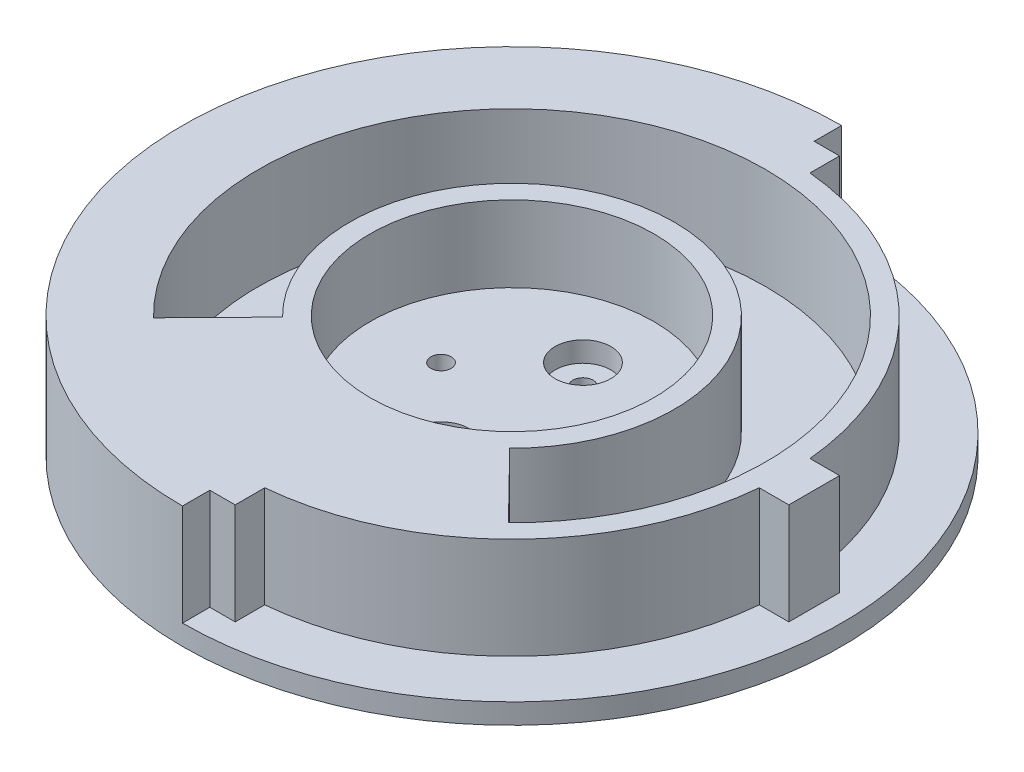
ISO-10303-21;
HEADER;
FILE_DESCRIPTION(('STEP AP214'),'2;1');
FILE_NAME('part.step','',(''),(''),'','','');
FILE_SCHEMA(('AUTOMOTIVE_DESIGN { 1 0 10303 214 1 1 1 1 }'));
ENDSEC;
DATA;
#1=APPLICATION_CONTEXT('core data for automotive mechanical design processes');
#2=APPLICATION_PROTOCOL_DEFINITION('international standard','automotive_design',2000,#1);
#3=PRODUCT_CONTEXT('',#1,'mechanical');
#4=PRODUCT('Part','Part','',(#3));
#5=PRODUCT_RELATED_PRODUCT_CATEGORY('part','',(#4));
#6=PRODUCT_DEFINITION_FORMATION('','',#4);
#7=PRODUCT_DEFINITION_CONTEXT('part definition',#1,'design');
#8=PRODUCT_DEFINITION('design','',#6,#7);
#9=PRODUCT_DEFINITION_SHAPE('','',#8);
#10=(LENGTH_UNIT() NAMED_UNIT(*) SI_UNIT(.MILLI.,.METRE.));
#11=(NAMED_UNIT(*) PLANE_ANGLE_UNIT() SI_UNIT($,.RADIAN.));
#12=(NAMED_UNIT(*) SI_UNIT($,.STERADIAN.) SOLID_ANGLE_UNIT());
#13=UNCERTAINTY_MEASURE_WITH_UNIT(LENGTH_MEASURE(1.E-05),#10,'distance_accuracy_value','');
#14=(GEOMETRIC_REPRESENTATION_CONTEXT(3) GLOBAL_UNCERTAINTY_ASSIGNED_CONTEXT((#13)) GLOBAL_UNIT_ASSIGNED_CONTEXT((#10,
#11,#12)) REPRESENTATION_CONTEXT('',''));
#15=CARTESIAN_POINT('',(0.,0.,0.));
#16=DIRECTION('',(0.,0.,1.));
#17=DIRECTION('',(1.,0.,0.));
#18=AXIS2_PLACEMENT_3D('',#15,#16,#17);
#19=CARTESIAN_POINT('',(0.,10.,7.));
#20=DIRECTION('',(0.,-1.,0.));
#21=DIRECTION('',(0.,0.,-1.));
#22=AXIS2_PLACEMENT_3D('',#19,#20,#21);
#23=CYLINDRICAL_SURFACE('',#22,1.);
#24=CARTESIAN_POINT('',(0.,-2.,7.));
#25=DIRECTION('',(0.,-1.,0.));
#26=DIRECTION('',(0.,0.,-1.));
#27=AXIS2_PLACEMENT_3D('',#24,#25,#26);
#28=CIRCLE('',#27,1.);
#29=CARTESIAN_POINT('',(0.,-2.,6.));
#30=VERTEX_POINT('',#29);
#31=EDGE_CURVE('E245',#30,#30,#28,.T.);
#32=ORIENTED_EDGE('',*,*,#31,.T.);
#33=EDGE_LOOP('',(#32));
#34=FACE_BOUND('',#33,.T.);
#35=CARTESIAN_POINT('',(0.,0.5,7.));
#36=DIRECTION('',(0.,1.,0.));
#37=DIRECTION('',(0.,0.,1.));
#38=AXIS2_PLACEMENT_3D('',#35,#36,#37);
#39=CIRCLE('',#38,1.);
#40=CARTESIAN_POINT('',(0.,0.5,8.));
#41=VERTEX_POINT('',#40);
#42=EDGE_CURVE('E39',#41,#41,#39,.F.);
#43=ORIENTED_EDGE('',*,*,#42,.F.);
#44=EDGE_LOOP('',(#43));
#45=FACE_BOUND('',#44,.T.);
#46=ADVANCED_FACE('F35',(#34,#45),#23,.F.);
#47=CARTESIAN_POINT('',(0.,10.,-7.));
#48=DIRECTION('',(0.,-1.,0.));
#49=DIRECTION('',(0.,0.,-1.));
#50=AXIS2_PLACEMENT_3D('',#47,#48,#49);
#51=CYLINDRICAL_SURFACE('',#50,1.);
#52=CARTESIAN_POINT('',(0.,-2.,-7.));
#53=DIRECTION('',(0.,-1.,0.));
#54=DIRECTION('',(0.,0.,-1.));
#55=AXIS2_PLACEMENT_3D('',#52,#53,#54);
#56=CIRCLE('',#55,1.);
#57=CARTESIAN_POINT('',(0.,-2.,-8.));
#58=VERTEX_POINT('',#57);
#59=EDGE_CURVE('E175',#58,#58,#56,.T.);
#60=ORIENTED_EDGE('',*,*,#59,.T.);
#61=EDGE_LOOP('',(#60));
#62=FACE_BOUND('',#61,.T.);
#63=CARTESIAN_POINT('',(0.,0.5,-7.));
#64=DIRECTION('',(0.,1.,0.));
#65=DIRECTION('',(0.,0.,1.));
#66=AXIS2_PLACEMENT_3D('',#63,#64,#65);
#67=CIRCLE('',#66,1.);
#68=CARTESIAN_POINT('',(0.,0.5,-6.));
#69=VERTEX_POINT('',#68);
#70=EDGE_CURVE('E246',#69,#69,#67,.F.);
#71=ORIENTED_EDGE('',*,*,#70,.F.);
#72=EDGE_LOOP('',(#71));
#73=FACE_BOUND('',#72,.T.);
#74=ADVANCED_FACE('F367',(#62,#73),#51,.F.);
#75=CARTESIAN_POINT('',(0.,0.,0.));
#76=DIRECTION('',(0.,-1.,0.));
#77=DIRECTION('',(0.,0.,-1.));
#78=AXIS2_PLACEMENT_3D('',#75,#76,#77);
#79=PLANE('',#78);
#80=DIRECTION('',(0.,0.,-1.));
#81=VECTOR('',#80,1.);
#82=CARTESIAN_POINT('',(0.,0.,-29.8));
#83=LINE('',#82,#81);
#84=CARTESIAN_POINT('',(0.,0.,-29.8));
#85=VERTEX_POINT('',#84);
#86=CARTESIAN_POINT('',(0.,0.,-32.5));
#87=VERTEX_POINT('',#86);
#88=EDGE_CURVE('E174',#85,#87,#83,.T.);
#89=ORIENTED_EDGE('',*,*,#88,.F.);
#90=DIRECTION('',(-1.,0.,0.));
#91=VECTOR('',#90,1.);
#92=CARTESIAN_POINT('',(-2.5,0.,-29.8));
#93=LINE('',#92,#91);
#94=CARTESIAN_POINT('',(2.5,0.,-29.8));
#95=VERTEX_POINT('',#94);
#96=EDGE_CURVE('E173',#95,#85,#93,.T.);
#97=ORIENTED_EDGE('',*,*,#96,.F.);
#98=DIRECTION('',(0.,0.,-1.));
#99=VECTOR('',#98,1.);
#100=CARTESIAN_POINT('',(2.5,0.,0.));
#101=LINE('',#100,#99);
#102=CARTESIAN_POINT('',(2.5,0.,-26.8840101175401));
#103=VERTEX_POINT('',#102);
#104=EDGE_CURVE('E44',#103,#95,#101,.T.);
#105=ORIENTED_EDGE('',*,*,#104,.F.);
#106=CARTESIAN_POINT('',(0.,0.,0.));
#107=DIRECTION('',(0.,1.,0.));
#108=DIRECTION('',(0.,0.,1.));
#109=AXIS2_PLACEMENT_3D('',#106,#107,#108);
#110=CIRCLE('',#109,27.);
#111=CARTESIAN_POINT('',(26.8840101175398,0.,-2.50000000000318));
#112=VERTEX_POINT('',#111);
#113=EDGE_CURVE('E196',#112,#103,#110,.T.);
#114=ORIENTED_EDGE('',*,*,#113,.F.);
#115=DIRECTION('',(-1.,0.,0.));
#116=VECTOR('',#115,1.);
#117=CARTESIAN_POINT('',(29.8000000000026,0.,-2.50000000000318));
#118=LINE('',#117,#116);
#119=CARTESIAN_POINT('',(29.8000000000026,0.,-2.50000000000318));
#120=VERTEX_POINT('',#119);
#121=EDGE_CURVE('E307',#120,#112,#118,.T.);
#122=ORIENTED_EDGE('',*,*,#121,.F.);
#123=DIRECTION('',(0.,0.,-1.));
#124=VECTOR('',#123,1.);
#125=CARTESIAN_POINT('',(29.8000000000026,0.,-2.50000000000318));
#126=LINE('',#125,#124);
#127=CARTESIAN_POINT('',(29.8000000000026,0.,2.49999999999682));
#128=VERTEX_POINT('',#127);
#129=EDGE_CURVE('E315',#128,#120,#126,.T.);
#130=ORIENTED_EDGE('',*,*,#129,.F.);
#131=DIRECTION('',(1.,0.,0.));
#132=VECTOR('',#131,1.);
#133=CARTESIAN_POINT('',(29.8000000000026,0.,2.49999999999682));
#134=LINE('',#133,#132);
#135=CARTESIAN_POINT('',(26.8840101175404,0.,2.49999999999682));
#136=VERTEX_POINT('',#135);
#137=EDGE_CURVE('E303',#136,#128,#134,.T.);
#138=ORIENTED_EDGE('',*,*,#137,.F.);
#139=CARTESIAN_POINT('',(2.50000000000583,0.,26.8840101175396));
#140=VERTEX_POINT('',#139);
#141=EDGE_CURVE('E214',#140,#136,#110,.T.);
#142=ORIENTED_EDGE('',*,*,#141,.F.);
#143=DIRECTION('',(0.,0.,-1.));
#144=VECTOR('',#143,1.);
#145=CARTESIAN_POINT('',(2.50000000000583,0.,29.7999999999995));
#146=LINE('',#145,#144);
#147=CARTESIAN_POINT('',(2.50000000000583,0.,29.7999999999995));
#148=VERTEX_POINT('',#147);
#149=EDGE_CURVE('E292',#148,#140,#146,.T.);
#150=ORIENTED_EDGE('',*,*,#149,.F.);
#151=DIRECTION('',(1.,0.,0.));
#152=VECTOR('',#151,1.);
#153=CARTESIAN_POINT('',(2.50000000000583,0.,29.7999999999995));
#154=LINE('',#153,#152);
#155=CARTESIAN_POINT('',(0.,0.,29.7999999999995));
#156=VERTEX_POINT('',#155);
#157=EDGE_CURVE('E52',#156,#148,#154,.T.);
#158=ORIENTED_EDGE('',*,*,#157,.F.);
#159=DIRECTION('',(0.,0.,-1.));
#160=VECTOR('',#159,1.);
#161=CARTESIAN_POINT('',(0.,0.,29.7999999999995));
#162=LINE('',#161,#160);
#163=CARTESIAN_POINT('',(0.,0.,32.5));
#164=VERTEX_POINT('',#163);
#165=EDGE_CURVE('E278',#164,#156,#162,.T.);
#166=ORIENTED_EDGE('',*,*,#165,.F.);
#167=CARTESIAN_POINT('',(0.,0.,0.));
#168=DIRECTION('',(0.,-1.,0.));
#169=DIRECTION('',(0.,0.,-1.));
#170=AXIS2_PLACEMENT_3D('',#167,#168,#169);
#171=CIRCLE('',#170,32.5);
#172=EDGE_CURVE('E192',#87,#164,#171,.T.);
#173=ORIENTED_EDGE('',*,*,#172,.F.);
#174=EDGE_LOOP('',(#89,#97,#105,#114,#122,#130,#138,#142,#150,#158,#166,#173));
#175=FACE_BOUND('',#174,.T.);
#176=ADVANCED_FACE('F334',(#175),#79,.F.);
#177=CARTESIAN_POINT('',(-2.5,10.,-29.8));
#178=DIRECTION('',(0.,0.,1.));
#179=DIRECTION('',(1.,0.,0.));
#180=AXIS2_PLACEMENT_3D('',#177,#178,#179);
#181=PLANE('',#180);
#182=DIRECTION('',(0.,-1.,0.));
#183=VECTOR('',#182,1.);
#184=CARTESIAN_POINT('',(0.,82.6722092687432,-29.8));
#185=LINE('',#184,#183);
#186=CARTESIAN_POINT('',(0.,9.99999999999999,-29.8));
#187=VERTEX_POINT('',#186);
#188=EDGE_CURVE('E157',#187,#85,#185,.T.);
#189=ORIENTED_EDGE('',*,*,#188,.F.);
#190=DIRECTION('',(-1.,0.,0.));
#191=VECTOR('',#190,1.);
#192=CARTESIAN_POINT('',(-2.5,10.,-29.8));
#193=LINE('',#192,#191);
#194=CARTESIAN_POINT('',(2.5,10.,-29.8));
#195=VERTEX_POINT('',#194);
#196=EDGE_CURVE('E171',#195,#187,#193,.T.);
#197=ORIENTED_EDGE('',*,*,#196,.F.);
#198=DIRECTION('',(0.,-1.,0.));
#199=VECTOR('',#198,1.);
#200=CARTESIAN_POINT('',(2.5,10.,-29.8));
#201=LINE('',#200,#199);
#202=EDGE_CURVE('E181',#195,#95,#201,.T.);
#203=ORIENTED_EDGE('',*,*,#202,.T.);
#204=ORIENTED_EDGE('',*,*,#96,.T.);
#205=EDGE_LOOP('',(#189,#197,#203,#204));
#206=FACE_BOUND('',#205,.T.);
#207=ADVANCED_FACE('F169',(#206),#181,.F.);
#208=CARTESIAN_POINT('',(2.50000000000583,10.,29.7999999999995));
#209=DIRECTION('',(0.,0.,-1.));
#210=DIRECTION('',(-1.,0.,0.));
#211=AXIS2_PLACEMENT_3D('',#208,#209,#210);
#212=PLANE('',#211);
#213=DIRECTION('',(0.,-1.,0.));
#214=VECTOR('',#213,1.);
#215=CARTESIAN_POINT('',(0.,82.6722092687432,29.7999999999995));
#216=LINE('',#215,#214);
#217=CARTESIAN_POINT('',(0.,9.99999999999999,29.7999999999995));
#218=VERTEX_POINT('',#217);
#219=EDGE_CURVE('E164',#218,#156,#216,.T.);
#220=ORIENTED_EDGE('',*,*,#219,.T.);
#221=ORIENTED_EDGE('',*,*,#157,.T.);
#222=DIRECTION('',(0.,-1.,0.));
#223=VECTOR('',#222,1.);
#224=CARTESIAN_POINT('',(2.50000000000583,10.,29.7999999999995));
#225=LINE('',#224,#223);
#226=CARTESIAN_POINT('',(2.50000000000583,10.,29.7999999999995));
#227=VERTEX_POINT('',#226);
#228=EDGE_CURVE('E295',#227,#148,#225,.T.);
#229=ORIENTED_EDGE('',*,*,#228,.F.);
#230=DIRECTION('',(1.,0.,0.));
#231=VECTOR('',#230,1.);
#232=CARTESIAN_POINT('',(2.50000000000583,10.,29.7999999999995));
#233=LINE('',#232,#231);
#234=EDGE_CURVE('E289',#218,#227,#233,.T.);
#235=ORIENTED_EDGE('',*,*,#234,.F.);
#236=EDGE_LOOP('',(#220,#221,#229,#235));
#237=FACE_BOUND('',#236,.T.);
#238=ADVANCED_FACE('F365',(#237),#212,.F.);
#239=CARTESIAN_POINT('',(0.,10.,0.));
#240=DIRECTION('',(0.,-1.,0.));
#241=DIRECTION('',(0.,0.,-1.));
#242=AXIS2_PLACEMENT_3D('',#239,#240,#241);
#243=CYLINDRICAL_SURFACE('',#242,27.);
#244=DIRECTION('',(0.,-1.,0.));
#245=VECTOR('',#244,1.);
#246=CARTESIAN_POINT('',(2.50000000000583,10.,26.8840101175396));
#247=LINE('',#246,#245);
#248=CARTESIAN_POINT('',(2.50000000000583,10.,26.8840101175396));
#249=VERTEX_POINT('',#248);
#250=EDGE_CURVE('E301',#140,#249,#247,.F.);
#251=ORIENTED_EDGE('',*,*,#250,.F.);
#252=ORIENTED_EDGE('',*,*,#141,.T.);
#253=DIRECTION('',(0.,-1.,0.));
#254=VECTOR('',#253,1.);
#255=CARTESIAN_POINT('',(26.8840101175404,10.,2.49999999999682));
#256=LINE('',#255,#254);
#257=CARTESIAN_POINT('',(26.8840101175404,10.,2.49999999999682));
#258=VERTEX_POINT('',#257);
#259=EDGE_CURVE('E188',#258,#136,#256,.T.);
#260=ORIENTED_EDGE('',*,*,#259,.F.);
#261=CARTESIAN_POINT('',(0.,10.,0.));
#262=DIRECTION('',(0.,1.,0.));
#263=DIRECTION('',(0.,0.,1.));
#264=AXIS2_PLACEMENT_3D('',#261,#262,#263);
#265=CIRCLE('',#264,27.);
#266=EDGE_CURVE('E60',#249,#258,#265,.T.);
#267=ORIENTED_EDGE('',*,*,#266,.F.);
#268=EDGE_LOOP('',(#251,#252,#260,#267));
#269=FACE_BOUND('',#268,.T.);
#270=ADVANCED_FACE('F37',(#269),#243,.T.);
#271=DIRECTION('',(0.,-1.,0.));
#272=VECTOR('',#271,1.);
#273=CARTESIAN_POINT('',(26.8840101175398,10.,-2.50000000000318));
#274=LINE('',#273,#272);
#275=CARTESIAN_POINT('',(26.8840101175398,10.,-2.50000000000318));
#276=VERTEX_POINT('',#275);
#277=EDGE_CURVE('E325',#112,#276,#274,.F.);
#278=ORIENTED_EDGE('',*,*,#277,.F.);
#279=ORIENTED_EDGE('',*,*,#113,.T.);
#280=DIRECTION('',(0.,-1.,0.));
#281=VECTOR('',#280,1.);
#282=CARTESIAN_POINT('',(2.5,10.,-26.8840101175401));
#283=LINE('',#282,#281);
#284=CARTESIAN_POINT('',(2.5,10.,-26.8840101175401));
#285=VERTEX_POINT('',#284);
#286=EDGE_CURVE('E183',#285,#103,#283,.T.);
#287=ORIENTED_EDGE('',*,*,#286,.F.);
#288=EDGE_CURVE('E233',#276,#285,#265,.T.);
#289=ORIENTED_EDGE('',*,*,#288,.F.);
#290=EDGE_LOOP('',(#278,#279,#287,#289));
#291=FACE_BOUND('',#290,.T.);
#292=ADVANCED_FACE('F358',(#291),#243,.T.);
#293=CARTESIAN_POINT('',(0.,10.,0.));
#294=DIRECTION('',(0.,1.,0.));
#295=DIRECTION('',(0.,0.,1.));
#296=AXIS2_PLACEMENT_3D('',#293,#294,#295);
#297=PLANE('',#296);
#298=ORIENTED_EDGE('',*,*,#196,.T.);
#299=DIRECTION('',(0.,0.,-1.));
#300=VECTOR('',#299,1.);
#301=CARTESIAN_POINT('',(0.,9.99999999999999,-29.8));
#302=LINE('',#301,#300);
#303=CARTESIAN_POINT('',(0.,9.99999999999999,-32.5));
#304=VERTEX_POINT('',#303);
#305=EDGE_CURVE('E153',#187,#304,#302,.T.);
#306=ORIENTED_EDGE('',*,*,#305,.T.);
#307=CARTESIAN_POINT('',(0.,9.99999999999999,0.));
#308=DIRECTION('',(0.,1.,0.));
#309=DIRECTION('',(0.,0.,1.));
#310=AXIS2_PLACEMENT_3D('',#307,#308,#309);
#311=CIRCLE('',#310,32.5);
#312=CARTESIAN_POINT('',(0.,9.99999999999999,32.5));
#313=VERTEX_POINT('',#312);
#314=EDGE_CURVE('E163',#304,#313,#311,.T.);
#315=ORIENTED_EDGE('',*,*,#314,.T.);
#316=DIRECTION('',(0.,0.,-1.));
#317=VECTOR('',#316,1.);
#318=CARTESIAN_POINT('',(0.,9.99999999999999,29.7999999999995));
#319=LINE('',#318,#317);
#320=EDGE_CURVE('E282',#313,#218,#319,.T.);
#321=ORIENTED_EDGE('',*,*,#320,.T.);
#322=ORIENTED_EDGE('',*,*,#234,.T.);
#323=DIRECTION('',(0.,0.,-1.));
#324=VECTOR('',#323,1.);
#325=CARTESIAN_POINT('',(2.50000000000583,10.,29.7999999999995));
#326=LINE('',#325,#324);
#327=EDGE_CURVE('E291',#227,#249,#326,.T.);
#328=ORIENTED_EDGE('',*,*,#327,.T.);
#329=ORIENTED_EDGE('',*,*,#266,.T.);
#330=DIRECTION('',(1.,0.,0.));
#331=VECTOR('',#330,1.);
#332=CARTESIAN_POINT('',(29.8000000000026,10.,2.49999999999682));
#333=LINE('',#332,#331);
#334=CARTESIAN_POINT('',(29.8000000000026,10.,2.49999999999682));
#335=VERTEX_POINT('',#334);
#336=EDGE_CURVE('E304',#258,#335,#333,.T.);
#337=ORIENTED_EDGE('',*,*,#336,.T.);
#338=DIRECTION('',(0.,0.,-1.));
#339=VECTOR('',#338,1.);
#340=CARTESIAN_POINT('',(29.8000000000026,10.,-2.50000000000318));
#341=LINE('',#340,#339);
#342=CARTESIAN_POINT('',(29.8000000000026,10.,-2.50000000000318));
#343=VERTEX_POINT('',#342);
#344=EDGE_CURVE('E306',#335,#343,#341,.T.);
#345=ORIENTED_EDGE('',*,*,#344,.T.);
#346=DIRECTION('',(-1.,0.,0.));
#347=VECTOR('',#346,1.);
#348=CARTESIAN_POINT('',(29.8000000000026,10.,-2.50000000000318));
#349=LINE('',#348,#347);
#350=EDGE_CURVE('E309',#343,#276,#349,.T.);
#351=ORIENTED_EDGE('',*,*,#350,.T.);
#352=ORIENTED_EDGE('',*,*,#288,.T.);
#353=DIRECTION('',(0.,0.,-1.));
#354=VECTOR('',#353,1.);
#355=CARTESIAN_POINT('',(2.5,10.,-29.8));
#356=LINE('',#355,#354);
#357=EDGE_CURVE('E180',#285,#195,#356,.T.);
#358=ORIENTED_EDGE('',*,*,#357,.T.);
#359=EDGE_LOOP('',(#298,#306,#315,#321,#322,#328,#329,#337,#345,#351,#352,#358));
#360=FACE_BOUND('',#359,.T.);
#361=CARTESIAN_POINT('',(0.,10.,0.));
#362=DIRECTION('',(0.,1.,0.));
#363=DIRECTION('',(0.,0.,1.));
#364=AXIS2_PLACEMENT_3D('',#361,#362,#363);
#365=CIRCLE('',#364,14.);
#366=CARTESIAN_POINT('',(0.,10.,14.));
#367=VERTEX_POINT('',#366);
#368=EDGE_CURVE('E230',#367,#367,#365,.T.);
#369=ORIENTED_EDGE('',*,*,#368,.F.);
#370=EDGE_LOOP('',(#369));
#371=FACE_BOUND('',#370,.T.);
#372=DIRECTION('',(0.7,0.,-0.714142842854285));
#373=VECTOR('',#372,1.);
#374=CARTESIAN_POINT('',(-17.5,10.,17.8535710713571));
#375=LINE('',#374,#373);
#376=CARTESIAN_POINT('',(-17.5,10.,17.8535710713571));
#377=VERTEX_POINT('',#376);
#378=CARTESIAN_POINT('',(-11.2,10.,11.4262854856686));
#379=VERTEX_POINT('',#378);
#380=EDGE_CURVE('E201',#377,#379,#375,.T.);
#381=ORIENTED_EDGE('',*,*,#380,.F.);
#382=CARTESIAN_POINT('',(0.,10.,0.));
#383=DIRECTION('',(0.,1.,0.));
#384=DIRECTION('',(0.,0.,1.));
#385=AXIS2_PLACEMENT_3D('',#382,#383,#384);
#386=CIRCLE('',#385,25.);
#387=CARTESIAN_POINT('',(17.5,10.,17.8535710713571));
#388=VERTEX_POINT('',#387);
#389=EDGE_CURVE('E199',#388,#377,#386,.T.);
#390=ORIENTED_EDGE('',*,*,#389,.F.);
#391=DIRECTION('',(0.7,0.,0.714142842854285));
#392=VECTOR('',#391,1.);
#393=CARTESIAN_POINT('',(17.5,10.,17.8535710713571));
#394=LINE('',#393,#392);
#395=CARTESIAN_POINT('',(11.2,10.,11.4262854856686));
#396=VERTEX_POINT('',#395);
#397=EDGE_CURVE('E207',#396,#388,#394,.T.);
#398=ORIENTED_EDGE('',*,*,#397,.F.);
#399=CARTESIAN_POINT('',(0.,10.,0.));
#400=DIRECTION('',(0.,-1.,0.));
#401=DIRECTION('',(0.,0.,1.));
#402=AXIS2_PLACEMENT_3D('',#399,#400,#401);
#403=CIRCLE('',#402,16.);
#404=EDGE_CURVE('E204',#379,#396,#403,.T.);
#405=ORIENTED_EDGE('',*,*,#404,.F.);
#406=EDGE_LOOP('',(#381,#390,#398,#405));
#407=FACE_BOUND('',#406,.T.);
#408=ADVANCED_FACE('F177',(#360,#371,#407),#297,.T.);
#409=CARTESIAN_POINT('',(0.,10.,0.));
#410=DIRECTION('',(0.,-1.,0.));
#411=DIRECTION('',(0.,0.,-1.));
#412=AXIS2_PLACEMENT_3D('',#409,#410,#411);
#413=CYLINDRICAL_SURFACE('',#412,14.);
#414=CARTESIAN_POINT('',(0.,2.5,0.));
#415=DIRECTION('',(0.,1.,0.));
#416=DIRECTION('',(0.,0.,1.));
#417=AXIS2_PLACEMENT_3D('',#414,#415,#416);
#418=CIRCLE('',#417,14.);
#419=CARTESIAN_POINT('',(0.,2.5,14.));
#420=VERTEX_POINT('',#419);
#421=EDGE_CURVE('E11',#420,#420,#418,.T.);
#422=ORIENTED_EDGE('',*,*,#421,.F.);
#423=EDGE_LOOP('',(#422));
#424=FACE_BOUND('',#423,.T.);
#425=ORIENTED_EDGE('',*,*,#368,.T.);
#426=EDGE_LOOP('',(#425));
#427=FACE_BOUND('',#426,.T.);
#428=ADVANCED_FACE('F364',(#424,#427),#413,.F.);
#429=CARTESIAN_POINT('',(0.,10.,0.));
#430=DIRECTION('',(0.,-1.,0.));
#431=DIRECTION('',(0.,0.,-1.));
#432=AXIS2_PLACEMENT_3D('',#429,#430,#431);
#433=CYLINDRICAL_SURFACE('',#432,25.);
#434=CARTESIAN_POINT('',(0.,0.,0.));
#435=DIRECTION('',(0.,1.,0.));
#436=DIRECTION('',(0.,0.,1.));
#437=AXIS2_PLACEMENT_3D('',#434,#435,#436);
#438=CIRCLE('',#437,25.);
#439=CARTESIAN_POINT('',(17.5,0.,17.8535710713571));
#440=VERTEX_POINT('',#439);
#441=CARTESIAN_POINT('',(-17.5,0.,17.8535710713571));
#442=VERTEX_POINT('',#441);
#443=EDGE_CURVE('E210',#440,#442,#438,.T.);
#444=ORIENTED_EDGE('',*,*,#443,.F.);
#445=DIRECTION('',(0.,-1.,0.));
#446=VECTOR('',#445,1.);
#447=CARTESIAN_POINT('',(17.5,10.,17.8535710713571));
#448=LINE('',#447,#446);
#449=EDGE_CURVE('E209',#388,#440,#448,.T.);
#450=ORIENTED_EDGE('',*,*,#449,.F.);
#451=ORIENTED_EDGE('',*,*,#389,.T.);
#452=DIRECTION('',(0.,-1.,0.));
#453=VECTOR('',#452,1.);
#454=CARTESIAN_POINT('',(-17.5,10.,17.8535710713571));
#455=LINE('',#454,#453);
#456=EDGE_CURVE('E227',#377,#442,#455,.T.);
#457=ORIENTED_EDGE('',*,*,#456,.T.);
#458=EDGE_LOOP('',(#444,#450,#451,#457));
#459=FACE_BOUND('',#458,.T.);
#460=ADVANCED_FACE('F427',(#459),#433,.F.);
#461=CARTESIAN_POINT('',(-17.5,10.,17.8535710713571));
#462=DIRECTION('',(-0.714142842854285,0.,-0.7));
#463=DIRECTION('',(-0.7,0.,0.714142842854285));
#464=AXIS2_PLACEMENT_3D('',#461,#462,#463);
#465=PLANE('',#464);
#466=DIRECTION('',(0.7,0.,-0.714142842854285));
#467=VECTOR('',#466,1.);
#468=CARTESIAN_POINT('',(-17.5,0.,17.8535710713571));
#469=LINE('',#468,#467);
#470=CARTESIAN_POINT('',(-11.2,0.,11.4262854856686));
#471=VERTEX_POINT('',#470);
#472=EDGE_CURVE('E213',#442,#471,#469,.T.);
#473=ORIENTED_EDGE('',*,*,#472,.F.);
#474=ORIENTED_EDGE('',*,*,#456,.F.);
#475=ORIENTED_EDGE('',*,*,#380,.T.);
#476=DIRECTION('',(0.,-1.,0.));
#477=VECTOR('',#476,1.);
#478=CARTESIAN_POINT('',(-11.2,10.,11.4262854856686));
#479=LINE('',#478,#477);
#480=EDGE_CURVE('E225',#379,#471,#479,.T.);
#481=ORIENTED_EDGE('',*,*,#480,.T.);
#482=EDGE_LOOP('',(#473,#474,#475,#481));
#483=FACE_BOUND('',#482,.T.);
#484=ADVANCED_FACE('F423',(#483),#465,.T.);
#485=CARTESIAN_POINT('',(0.,10.,0.));
#486=DIRECTION('',(0.,-1.,0.));
#487=DIRECTION('',(0.,0.,-1.));
#488=AXIS2_PLACEMENT_3D('',#485,#486,#487);
#489=CYLINDRICAL_SURFACE('',#488,16.);
#490=CARTESIAN_POINT('',(0.,0.,0.));
#491=DIRECTION('',(0.,-1.,0.));
#492=DIRECTION('',(0.,0.,1.));
#493=AXIS2_PLACEMENT_3D('',#490,#491,#492);
#494=CIRCLE('',#493,16.);
#495=CARTESIAN_POINT('',(11.2,0.,11.4262854856686));
#496=VERTEX_POINT('',#495);
#497=EDGE_CURVE('E217',#471,#496,#494,.T.);
#498=ORIENTED_EDGE('',*,*,#497,.F.);
#499=ORIENTED_EDGE('',*,*,#480,.F.);
#500=ORIENTED_EDGE('',*,*,#404,.T.);
#501=DIRECTION('',(0.,-1.,0.));
#502=VECTOR('',#501,1.);
#503=CARTESIAN_POINT('',(11.2,10.,11.4262854856686));
#504=LINE('',#503,#502);
#505=EDGE_CURVE('E223',#396,#496,#504,.T.);
#506=ORIENTED_EDGE('',*,*,#505,.T.);
#507=EDGE_LOOP('',(#498,#499,#500,#506));
#508=FACE_BOUND('',#507,.T.);
#509=ADVANCED_FACE('F419',(#508),#489,.T.);
#510=CARTESIAN_POINT('',(17.5,10.,17.8535710713571));
#511=DIRECTION('',(0.714142842854285,0.,-0.7));
#512=DIRECTION('',(-0.7,0.,-0.714142842854285));
#513=AXIS2_PLACEMENT_3D('',#510,#511,#512);
#514=PLANE('',#513);
#515=DIRECTION('',(0.7,0.,0.714142842854285));
#516=VECTOR('',#515,1.);
#517=CARTESIAN_POINT('',(17.5,0.,17.8535710713571));
#518=LINE('',#517,#516);
#519=EDGE_CURVE('E202',#496,#440,#518,.T.);
#520=ORIENTED_EDGE('',*,*,#519,.F.);
#521=ORIENTED_EDGE('',*,*,#505,.F.);
#522=ORIENTED_EDGE('',*,*,#397,.T.);
#523=ORIENTED_EDGE('',*,*,#449,.T.);
#524=EDGE_LOOP('',(#520,#521,#522,#523));
#525=FACE_BOUND('',#524,.T.);
#526=ADVANCED_FACE('F416',(#525),#514,.T.);
#527=ORIENTED_EDGE('',*,*,#519,.T.);
#528=ORIENTED_EDGE('',*,*,#443,.T.);
#529=ORIENTED_EDGE('',*,*,#472,.T.);
#530=ORIENTED_EDGE('',*,*,#497,.T.);
#531=EDGE_LOOP('',(#527,#528,#529,#530));
#532=FACE_BOUND('',#531,.T.);
#533=ADVANCED_FACE('F409',(#532),#79,.F.);
#534=CARTESIAN_POINT('',(0.,-2.,0.));
#535=DIRECTION('',(0.,-1.,0.));
#536=DIRECTION('',(0.,0.,-1.));
#537=AXIS2_PLACEMENT_3D('',#534,#535,#536);
#538=PLANE('',#537);
#539=CARTESIAN_POINT('',(0.,-2.,0.));
#540=DIRECTION('',(0.,-1.,0.));
#541=DIRECTION('',(0.,0.,-1.));
#542=AXIS2_PLACEMENT_3D('',#539,#540,#541);
#543=CIRCLE('',#542,4.25);
#544=CARTESIAN_POINT('',(0.,-2.,-4.25));
#545=VERTEX_POINT('',#544);
#546=EDGE_CURVE('E261',#545,#545,#543,.T.);
#547=ORIENTED_EDGE('',*,*,#546,.F.);
#548=EDGE_LOOP('',(#547));
#549=FACE_BOUND('',#548,.T.);
#550=ORIENTED_EDGE('',*,*,#59,.F.);
#551=EDGE_LOOP('',(#550));
#552=FACE_BOUND('',#551,.T.);
#553=CARTESIAN_POINT('',(-7.,-2.,0.));
#554=DIRECTION('',(0.,-1.,0.));
#555=DIRECTION('',(0.,0.,-1.));
#556=AXIS2_PLACEMENT_3D('',#553,#554,#555);
#557=CIRCLE('',#556,1.);
#558=CARTESIAN_POINT('',(-7.,-2.,-0.999999999999975));
#559=VERTEX_POINT('',#558);
#560=EDGE_CURVE('E244',#559,#559,#557,.T.);
#561=ORIENTED_EDGE('',*,*,#560,.F.);
#562=EDGE_LOOP('',(#561));
#563=FACE_BOUND('',#562,.T.);
#564=ORIENTED_EDGE('',*,*,#31,.F.);
#565=EDGE_LOOP('',(#564));
#566=FACE_BOUND('',#565,.T.);
#567=CARTESIAN_POINT('',(7.,-2.,0.));
#568=DIRECTION('',(0.,-1.,0.));
#569=DIRECTION('',(0.,0.,-1.));
#570=AXIS2_PLACEMENT_3D('',#567,#568,#569);
#571=CIRCLE('',#570,1.);
#572=CARTESIAN_POINT('',(7.,-2.,-1.00000000000007));
#573=VERTEX_POINT('',#572);
#574=EDGE_CURVE('E241',#573,#573,#571,.T.);
#575=ORIENTED_EDGE('',*,*,#574,.F.);
#576=EDGE_LOOP('',(#575));
#577=FACE_BOUND('',#576,.T.);
#578=CARTESIAN_POINT('',(0.,-2.,0.));
#579=DIRECTION('',(0.,-1.,0.));
#580=DIRECTION('',(0.,0.,-1.));
#581=AXIS2_PLACEMENT_3D('',#578,#579,#580);
#582=CIRCLE('',#581,32.5);
#583=CARTESIAN_POINT('',(0.,-2.,-32.5));
#584=VERTEX_POINT('',#583);
#585=EDGE_CURVE('E193',#584,#584,#582,.T.);
#586=ORIENTED_EDGE('',*,*,#585,.T.);
#587=EDGE_LOOP('',(#586));
#588=FACE_BOUND('',#587,.T.);
#589=ADVANCED_FACE('F406',(#549,#552,#563,#566,#577,#588),#538,.T.);
#590=CARTESIAN_POINT('',(0.,-2.,0.));
#591=DIRECTION('',(0.,1.,0.));
#592=DIRECTION('',(0.,0.,1.));
#593=AXIS2_PLACEMENT_3D('',#590,#591,#592);
#594=CYLINDRICAL_SURFACE('',#593,32.5);
#595=ORIENTED_EDGE('',*,*,#585,.F.);
#596=EDGE_LOOP('',(#595));
#597=FACE_BOUND('',#596,.T.);
#598=ORIENTED_EDGE('',*,*,#172,.T.);
#599=DIRECTION('',(0.,-1.,0.));
#600=VECTOR('',#599,1.);
#601=CARTESIAN_POINT('',(0.,82.6722092687432,32.5));
#602=LINE('',#601,#600);
#603=EDGE_CURVE('E280',#313,#164,#602,.T.);
#604=ORIENTED_EDGE('',*,*,#603,.F.);
#605=ORIENTED_EDGE('',*,*,#314,.F.);
#606=DIRECTION('',(0.,-1.,0.));
#607=VECTOR('',#606,1.);
#608=CARTESIAN_POINT('',(0.,82.6722092687432,-32.5));
#609=LINE('',#608,#607);
#610=EDGE_CURVE('E159',#304,#87,#609,.T.);
#611=ORIENTED_EDGE('',*,*,#610,.T.);
#612=EDGE_LOOP('',(#598,#604,#605,#611));
#613=FACE_BOUND('',#612,.T.);
#614=ADVANCED_FACE('F353',(#597,#613),#594,.T.);
#615=CARTESIAN_POINT('',(2.5,10.,-29.8));
#616=DIRECTION('',(-1.,0.,0.));
#617=DIRECTION('',(0.,0.,1.));
#618=AXIS2_PLACEMENT_3D('',#615,#616,#617);
#619=PLANE('',#618);
#620=ORIENTED_EDGE('',*,*,#357,.F.);
#621=ORIENTED_EDGE('',*,*,#286,.T.);
#622=ORIENTED_EDGE('',*,*,#104,.T.);
#623=ORIENTED_EDGE('',*,*,#202,.F.);
#624=EDGE_LOOP('',(#620,#621,#622,#623));
#625=FACE_BOUND('',#624,.T.);
#626=ADVANCED_FACE('F356',(#625),#619,.F.);
#627=CARTESIAN_POINT('',(29.8000000000026,10.,2.49999999999682));
#628=DIRECTION('',(0.,0.,-1.));
#629=DIRECTION('',(-1.,0.,0.));
#630=AXIS2_PLACEMENT_3D('',#627,#628,#629);
#631=PLANE('',#630);
#632=ORIENTED_EDGE('',*,*,#336,.F.);
#633=ORIENTED_EDGE('',*,*,#259,.T.);
#634=ORIENTED_EDGE('',*,*,#137,.T.);
#635=DIRECTION('',(0.,-1.,0.));
#636=VECTOR('',#635,1.);
#637=CARTESIAN_POINT('',(29.8000000000026,10.,2.49999999999682));
#638=LINE('',#637,#636);
#639=EDGE_CURVE('E322',#335,#128,#638,.T.);
#640=ORIENTED_EDGE('',*,*,#639,.F.);
#641=EDGE_LOOP('',(#632,#633,#634,#640));
#642=FACE_BOUND('',#641,.T.);
#643=ADVANCED_FACE('F330',(#642),#631,.F.);
#644=CARTESIAN_POINT('',(29.8000000000026,10.,-2.50000000000318));
#645=DIRECTION('',(0.,0.,1.));
#646=DIRECTION('',(1.,0.,0.));
#647=AXIS2_PLACEMENT_3D('',#644,#645,#646);
#648=PLANE('',#647);
#649=ORIENTED_EDGE('',*,*,#121,.T.);
#650=ORIENTED_EDGE('',*,*,#277,.T.);
#651=ORIENTED_EDGE('',*,*,#350,.F.);
#652=DIRECTION('',(0.,-1.,0.));
#653=VECTOR('',#652,1.);
#654=CARTESIAN_POINT('',(29.8000000000026,10.,-2.50000000000318));
#655=LINE('',#654,#653);
#656=EDGE_CURVE('E312',#343,#120,#655,.T.);
#657=ORIENTED_EDGE('',*,*,#656,.T.);
#658=EDGE_LOOP('',(#649,#650,#651,#657));
#659=FACE_BOUND('',#658,.T.);
#660=ADVANCED_FACE('F341',(#659),#648,.F.);
#661=CARTESIAN_POINT('',(29.8000000000026,10.,-2.50000000000318));
#662=DIRECTION('',(-1.,0.,0.));
#663=DIRECTION('',(0.,0.,1.));
#664=AXIS2_PLACEMENT_3D('',#661,#662,#663);
#665=PLANE('',#664);
#666=ORIENTED_EDGE('',*,*,#129,.T.);
#667=ORIENTED_EDGE('',*,*,#656,.F.);
#668=ORIENTED_EDGE('',*,*,#344,.F.);
#669=ORIENTED_EDGE('',*,*,#639,.T.);
#670=EDGE_LOOP('',(#666,#667,#668,#669));
#671=FACE_BOUND('',#670,.T.);
#672=ADVANCED_FACE('F337',(#671),#665,.F.);
#673=CARTESIAN_POINT('',(2.50000000000583,10.,29.7999999999995));
#674=DIRECTION('',(-1.,0.,0.));
#675=DIRECTION('',(0.,0.,1.));
#676=AXIS2_PLACEMENT_3D('',#673,#674,#675);
#677=PLANE('',#676);
#678=ORIENTED_EDGE('',*,*,#149,.T.);
#679=ORIENTED_EDGE('',*,*,#250,.T.);
#680=ORIENTED_EDGE('',*,*,#327,.F.);
#681=ORIENTED_EDGE('',*,*,#228,.T.);
#682=EDGE_LOOP('',(#678,#679,#680,#681));
#683=FACE_BOUND('',#682,.T.);
#684=ADVANCED_FACE('F347',(#683),#677,.F.);
#685=CARTESIAN_POINT('',(0.,82.6722092687432,-29.8));
#686=DIRECTION('',(-1.,0.,0.));
#687=DIRECTION('',(0.,0.,1.));
#688=AXIS2_PLACEMENT_3D('',#685,#686,#687);
#689=PLANE('',#688);
#690=ORIENTED_EDGE('',*,*,#305,.F.);
#691=ORIENTED_EDGE('',*,*,#188,.T.);
#692=ORIENTED_EDGE('',*,*,#88,.T.);
#693=ORIENTED_EDGE('',*,*,#610,.F.);
#694=EDGE_LOOP('',(#690,#691,#692,#693));
#695=FACE_BOUND('',#694,.T.);
#696=ADVANCED_FACE('F155',(#695),#689,.F.);
#697=CARTESIAN_POINT('',(0.,82.6722092687432,29.7999999999995));
#698=DIRECTION('',(-1.,0.,0.));
#699=DIRECTION('',(0.,0.,1.));
#700=AXIS2_PLACEMENT_3D('',#697,#698,#699);
#701=PLANE('',#700);
#702=ORIENTED_EDGE('',*,*,#320,.F.);
#703=ORIENTED_EDGE('',*,*,#603,.T.);
#704=ORIENTED_EDGE('',*,*,#165,.T.);
#705=ORIENTED_EDGE('',*,*,#219,.F.);
#706=EDGE_LOOP('',(#702,#703,#704,#705));
#707=FACE_BOUND('',#706,.T.);
#708=ADVANCED_FACE('F386',(#707),#701,.F.);
#709=CARTESIAN_POINT('',(0.,2.5,0.));
#710=DIRECTION('',(0.,1.,0.));
#711=DIRECTION('',(0.,0.,1.));
#712=AXIS2_PLACEMENT_3D('',#709,#710,#711);
#713=PLANE('',#712);
#714=CARTESIAN_POINT('',(0.,2.5,-7.));
#715=DIRECTION('',(0.,1.,0.));
#716=DIRECTION('',(0.,0.,1.));
#717=AXIS2_PLACEMENT_3D('',#714,#715,#716);
#718=CIRCLE('',#717,2.75);
#719=CARTESIAN_POINT('',(0.,2.5,-4.25));
#720=VERTEX_POINT('',#719);
#721=EDGE_CURVE('E253',#720,#720,#718,.T.);
#722=ORIENTED_EDGE('',*,*,#721,.F.);
#723=EDGE_LOOP('',(#722));
#724=FACE_BOUND('',#723,.T.);
#725=CARTESIAN_POINT('',(0.,2.5,7.));
#726=DIRECTION('',(0.,1.,0.));
#727=DIRECTION('',(0.,0.,1.));
#728=AXIS2_PLACEMENT_3D('',#725,#726,#727);
#729=CIRCLE('',#728,2.75);
#730=CARTESIAN_POINT('',(0.,2.5,9.75));
#731=VERTEX_POINT('',#730);
#732=EDGE_CURVE('E266',#731,#731,#729,.T.);
#733=ORIENTED_EDGE('',*,*,#732,.F.);
#734=EDGE_LOOP('',(#733));
#735=FACE_BOUND('',#734,.T.);
#736=CARTESIAN_POINT('',(-7.,2.5,0.));
#737=DIRECTION('',(0.,1.,0.));
#738=DIRECTION('',(0.,0.,1.));
#739=AXIS2_PLACEMENT_3D('',#736,#737,#738);
#740=CIRCLE('',#739,1.);
#741=CARTESIAN_POINT('',(-7.,2.5,1.00000000000002));
#742=VERTEX_POINT('',#741);
#743=EDGE_CURVE('E242',#742,#742,#740,.T.);
#744=ORIENTED_EDGE('',*,*,#743,.F.);
#745=EDGE_LOOP('',(#744));
#746=FACE_BOUND('',#745,.T.);
#747=CARTESIAN_POINT('',(7.,2.5,0.));
#748=DIRECTION('',(0.,1.,0.));
#749=DIRECTION('',(0.,0.,1.));
#750=AXIS2_PLACEMENT_3D('',#747,#748,#749);
#751=CIRCLE('',#750,1.);
#752=CARTESIAN_POINT('',(7.,2.5,0.999999999999926));
#753=VERTEX_POINT('',#752);
#754=EDGE_CURVE('E238',#753,#753,#751,.T.);
#755=ORIENTED_EDGE('',*,*,#754,.F.);
#756=EDGE_LOOP('',(#755));
#757=FACE_BOUND('',#756,.T.);
#758=ORIENTED_EDGE('',*,*,#421,.T.);
#759=EDGE_LOOP('',(#758));
#760=FACE_BOUND('',#759,.T.);
#761=ADVANCED_FACE('F382',(#724,#735,#746,#757,#760),#713,.T.);
#762=CARTESIAN_POINT('',(7.,10.,0.));
#763=DIRECTION('',(0.,-1.,0.));
#764=DIRECTION('',(0.,0.,-1.));
#765=AXIS2_PLACEMENT_3D('',#762,#763,#764);
#766=CYLINDRICAL_SURFACE('',#765,1.);
#767=ORIENTED_EDGE('',*,*,#574,.T.);
#768=EDGE_LOOP('',(#767));
#769=FACE_BOUND('',#768,.T.);
#770=ORIENTED_EDGE('',*,*,#754,.T.);
#771=EDGE_LOOP('',(#770));
#772=FACE_BOUND('',#771,.T.);
#773=ADVANCED_FACE('F379',(#769,#772),#766,.F.);
#774=CARTESIAN_POINT('',(-7.,10.,0.));
#775=DIRECTION('',(0.,-1.,0.));
#776=DIRECTION('',(0.,0.,-1.));
#777=AXIS2_PLACEMENT_3D('',#774,#775,#776);
#778=CYLINDRICAL_SURFACE('',#777,1.);
#779=ORIENTED_EDGE('',*,*,#560,.T.);
#780=EDGE_LOOP('',(#779));
#781=FACE_BOUND('',#780,.T.);
#782=ORIENTED_EDGE('',*,*,#743,.T.);
#783=EDGE_LOOP('',(#782));
#784=FACE_BOUND('',#783,.T.);
#785=ADVANCED_FACE('F378',(#781,#784),#778,.F.);
#786=CARTESIAN_POINT('',(0.,0.5,-7.));
#787=DIRECTION('',(0.,1.,0.));
#788=DIRECTION('',(0.,0.,1.));
#789=AXIS2_PLACEMENT_3D('',#786,#787,#788);
#790=PLANE('',#789);
#791=CARTESIAN_POINT('',(0.,0.5,-7.));
#792=DIRECTION('',(0.,1.,0.));
#793=DIRECTION('',(0.,0.,1.));
#794=AXIS2_PLACEMENT_3D('',#791,#792,#793);
#795=CIRCLE('',#794,2.75);
#796=CARTESIAN_POINT('',(0.,0.5,-4.25));
#797=VERTEX_POINT('',#796);
#798=EDGE_CURVE('E248',#797,#797,#795,.T.);
#799=ORIENTED_EDGE('',*,*,#798,.T.);
#800=EDGE_LOOP('',(#799));
#801=FACE_BOUND('',#800,.T.);
#802=ORIENTED_EDGE('',*,*,#70,.T.);
#803=EDGE_LOOP('',(#802));
#804=FACE_BOUND('',#803,.T.);
#805=ADVANCED_FACE('F513',(#801,#804),#790,.T.);
#806=CARTESIAN_POINT('',(0.,0.5,-7.));
#807=DIRECTION('',(0.,1.,0.));
#808=DIRECTION('',(0.,0.,1.));
#809=AXIS2_PLACEMENT_3D('',#806,#807,#808);
#810=CYLINDRICAL_SURFACE('',#809,2.75);
#811=ORIENTED_EDGE('',*,*,#798,.F.);
#812=EDGE_LOOP('',(#811));
#813=FACE_BOUND('',#812,.T.);
#814=ORIENTED_EDGE('',*,*,#721,.T.);
#815=EDGE_LOOP('',(#814));
#816=FACE_BOUND('',#815,.T.);
#817=ADVANCED_FACE('F519',(#813,#816),#810,.F.);
#818=CARTESIAN_POINT('',(0.,0.5,7.));
#819=DIRECTION('',(0.,1.,0.));
#820=DIRECTION('',(0.,0.,1.));
#821=AXIS2_PLACEMENT_3D('',#818,#819,#820);
#822=PLANE('',#821);
#823=CARTESIAN_POINT('',(0.,0.5,7.));
#824=DIRECTION('',(0.,1.,0.));
#825=DIRECTION('',(0.,0.,1.));
#826=AXIS2_PLACEMENT_3D('',#823,#824,#825);
#827=CIRCLE('',#826,2.75);
#828=CARTESIAN_POINT('',(0.,0.5,9.75));
#829=VERTEX_POINT('',#828);
#830=EDGE_CURVE('E258',#829,#829,#827,.T.);
#831=ORIENTED_EDGE('',*,*,#830,.T.);
#832=EDGE_LOOP('',(#831));
#833=FACE_BOUND('',#832,.T.);
#834=ORIENTED_EDGE('',*,*,#42,.T.);
#835=EDGE_LOOP('',(#834));
#836=FACE_BOUND('',#835,.T.);
#837=ADVANCED_FACE('F526',(#833,#836),#822,.T.);
#838=CARTESIAN_POINT('',(0.,0.5,7.));
#839=DIRECTION('',(0.,1.,0.));
#840=DIRECTION('',(0.,0.,1.));
#841=AXIS2_PLACEMENT_3D('',#838,#839,#840);
#842=CYLINDRICAL_SURFACE('',#841,2.75);
#843=ORIENTED_EDGE('',*,*,#830,.F.);
#844=EDGE_LOOP('',(#843));
#845=FACE_BOUND('',#844,.T.);
#846=ORIENTED_EDGE('',*,*,#732,.T.);
#847=EDGE_LOOP('',(#846));
#848=FACE_BOUND('',#847,.T.);
#849=ADVANCED_FACE('F534',(#845,#848),#842,.F.);
#850=CARTESIAN_POINT('',(0.,-1.,0.));
#851=DIRECTION('',(0.,-1.,0.));
#852=DIRECTION('',(0.,0.,-1.));
#853=AXIS2_PLACEMENT_3D('',#850,#851,#852);
#854=CYLINDRICAL_SURFACE('',#853,4.25);
#855=CARTESIAN_POINT('',(0.,-1.,0.));
#856=DIRECTION('',(0.,-1.,0.));
#857=DIRECTION('',(0.,0.,-1.));
#858=AXIS2_PLACEMENT_3D('',#855,#856,#857);
#859=CIRCLE('',#858,4.25);
#860=CARTESIAN_POINT('',(0.,-1.,-4.25));
#861=VERTEX_POINT('',#860);
#862=EDGE_CURVE('E269',#861,#861,#859,.T.);
#863=ORIENTED_EDGE('',*,*,#862,.F.);
#864=EDGE_LOOP('',(#863));
#865=FACE_BOUND('',#864,.T.);
#866=ORIENTED_EDGE('',*,*,#546,.T.);
#867=EDGE_LOOP('',(#866));
#868=FACE_BOUND('',#867,.T.);
#869=ADVANCED_FACE('F541',(#865,#868),#854,.F.);
#870=CARTESIAN_POINT('',(0.,-1.,0.));
#871=DIRECTION('',(0.,-1.,0.));
#872=DIRECTION('',(0.,0.,-1.));
#873=AXIS2_PLACEMENT_3D('',#870,#871,#872);
#874=PLANE('',#873);
#875=ORIENTED_EDGE('',*,*,#862,.T.);
#876=EDGE_LOOP('',(#875));
#877=FACE_BOUND('',#876,.T.);
#878=ADVANCED_FACE('F548',(#877),#874,.T.);
#879=CLOSED_SHELL('',(#46,#74,#176,#207,#238,#270,#292,#408,#428,#460,#484,#509,#526,#533,#589,
#614,#626,#643,#660,#672,#684,#696,#708,#761,#773,#785,#805,#817,#837,#849,#869,#878));
#880=MANIFOLD_SOLID_BREP('B2',#879);
#881=ADVANCED_BREP_SHAPE_REPRESENTATION('',(#18,#880),#14);
#882=SHAPE_DEFINITION_REPRESENTATION(#9,#881);
ENDSEC;
END-ISO-10303-21;
